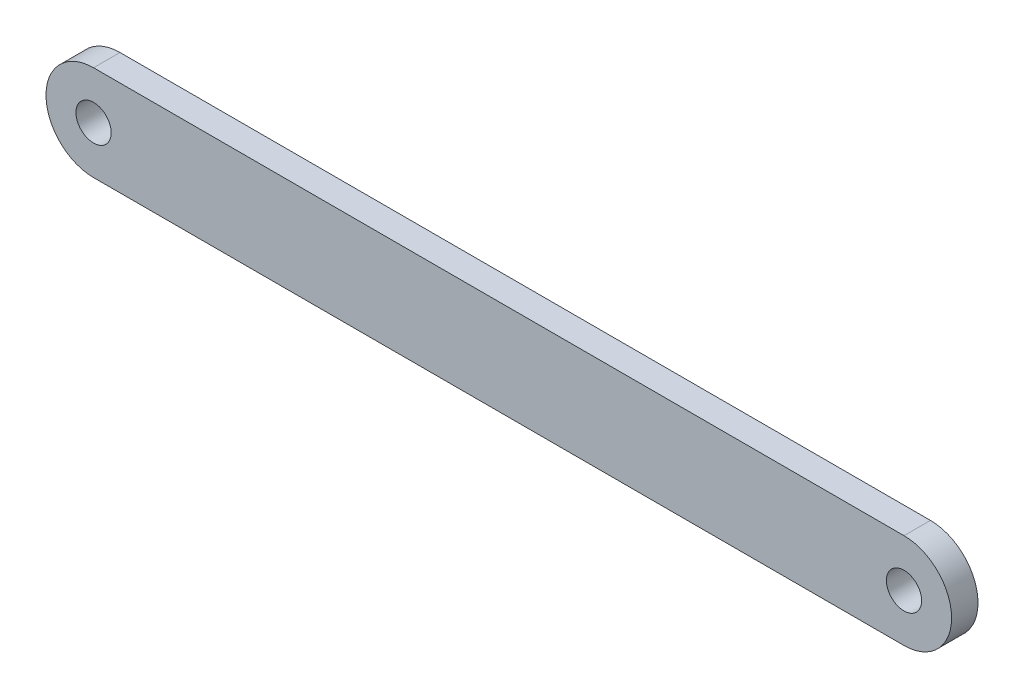
ISO-10303-21;
HEADER;
FILE_DESCRIPTION(('STEP AP214'),'2;1');
FILE_NAME('part.step','',(''),(''),'','','');
FILE_SCHEMA(('AUTOMOTIVE_DESIGN { 1 0 10303 214 1 1 1 1 }'));
ENDSEC;
DATA;
#1=APPLICATION_CONTEXT('core data for automotive mechanical design processes');
#2=APPLICATION_PROTOCOL_DEFINITION('international standard','automotive_design',2000,#1);
#3=PRODUCT_CONTEXT('',#1,'mechanical');
#4=PRODUCT('Part','Part','',(#3));
#5=PRODUCT_RELATED_PRODUCT_CATEGORY('part','',(#4));
#6=PRODUCT_DEFINITION_FORMATION('','',#4);
#7=PRODUCT_DEFINITION_CONTEXT('part definition',#1,'design');
#8=PRODUCT_DEFINITION('design','',#6,#7);
#9=PRODUCT_DEFINITION_SHAPE('','',#8);
#10=(LENGTH_UNIT() NAMED_UNIT(*) SI_UNIT(.MILLI.,.METRE.));
#11=(NAMED_UNIT(*) PLANE_ANGLE_UNIT() SI_UNIT($,.RADIAN.));
#12=(NAMED_UNIT(*) SI_UNIT($,.STERADIAN.) SOLID_ANGLE_UNIT());
#13=UNCERTAINTY_MEASURE_WITH_UNIT(LENGTH_MEASURE(1.E-05),#10,'distance_accuracy_value','');
#14=(GEOMETRIC_REPRESENTATION_CONTEXT(3) GLOBAL_UNCERTAINTY_ASSIGNED_CONTEXT((#13)) GLOBAL_UNIT_ASSIGNED_CONTEXT((#10,
#11,#12)) REPRESENTATION_CONTEXT('',''));
#15=CARTESIAN_POINT('',(0.,0.,0.));
#16=DIRECTION('',(0.,0.,1.));
#17=DIRECTION('',(1.,0.,0.));
#18=AXIS2_PLACEMENT_3D('',#15,#16,#17);
#19=CARTESIAN_POINT('',(230.,4.49640324973188E-12,-15.));
#20=DIRECTION('',(0.,0.,1.));
#21=DIRECTION('',(1.,0.,0.));
#22=AXIS2_PLACEMENT_3D('',#19,#20,#21);
#23=CYLINDRICAL_SURFACE('',#22,27.);
#24=CARTESIAN_POINT('',(230.,4.49640324973188E-12,0.));
#25=DIRECTION('',(0.,0.,1.));
#26=DIRECTION('',(-1.,0.,0.));
#27=AXIS2_PLACEMENT_3D('',#24,#25,#26);
#28=CIRCLE('',#27,27.);
#29=CARTESIAN_POINT('',(230.,-27.,0.));
#30=VERTEX_POINT('',#29);
#31=CARTESIAN_POINT('',(230.,27.,0.));
#32=VERTEX_POINT('',#31);
#33=EDGE_CURVE('E105',#30,#32,#28,.T.);
#34=ORIENTED_EDGE('',*,*,#33,.F.);
#35=DIRECTION('',(0.,0.,1.));
#36=VECTOR('',#35,1.);
#37=CARTESIAN_POINT('',(230.,-27.,-15.));
#38=LINE('',#37,#36);
#39=CARTESIAN_POINT('',(230.,-27.,-15.));
#40=VERTEX_POINT('',#39);
#41=EDGE_CURVE('E11',#40,#30,#38,.T.);
#42=ORIENTED_EDGE('',*,*,#41,.F.);
#43=CARTESIAN_POINT('',(230.,4.49640324973188E-12,-15.));
#44=DIRECTION('',(0.,0.,1.));
#45=DIRECTION('',(-1.,0.,0.));
#46=AXIS2_PLACEMENT_3D('',#43,#44,#45);
#47=CIRCLE('',#46,27.);
#48=CARTESIAN_POINT('',(230.,27.,-15.));
#49=VERTEX_POINT('',#48);
#50=EDGE_CURVE('E92',#40,#49,#47,.T.);
#51=ORIENTED_EDGE('',*,*,#50,.T.);
#52=DIRECTION('',(0.,0.,1.));
#53=VECTOR('',#52,1.);
#54=CARTESIAN_POINT('',(230.,27.,-15.));
#55=LINE('',#54,#53);
#56=EDGE_CURVE('E37',#49,#32,#55,.T.);
#57=ORIENTED_EDGE('',*,*,#56,.T.);
#58=EDGE_LOOP('',(#34,#42,#51,#57));
#59=FACE_BOUND('',#58,.T.);
#60=ADVANCED_FACE('F40',(#59),#23,.T.);
#61=CARTESIAN_POINT('',(-230.,-27.,-15.));
#62=DIRECTION('',(0.,-1.,0.));
#63=DIRECTION('',(0.,0.,-1.));
#64=AXIS2_PLACEMENT_3D('',#61,#62,#63);
#65=PLANE('',#64);
#66=DIRECTION('',(1.,0.,0.));
#67=VECTOR('',#66,1.);
#68=CARTESIAN_POINT('',(-230.,-27.,0.));
#69=LINE('',#68,#67);
#70=CARTESIAN_POINT('',(-230.,-26.9999999999955,0.));
#71=VERTEX_POINT('',#70);
#72=EDGE_CURVE('E100',#71,#30,#69,.T.);
#73=ORIENTED_EDGE('',*,*,#72,.F.);
#74=DIRECTION('',(0.,0.,1.));
#75=VECTOR('',#74,1.);
#76=CARTESIAN_POINT('',(-230.,-26.9999999999955,-15.));
#77=LINE('',#76,#75);
#78=CARTESIAN_POINT('',(-230.,-26.9999999999955,-15.));
#79=VERTEX_POINT('',#78);
#80=EDGE_CURVE('E46',#79,#71,#77,.T.);
#81=ORIENTED_EDGE('',*,*,#80,.F.);
#82=DIRECTION('',(1.,0.,0.));
#83=VECTOR('',#82,1.);
#84=CARTESIAN_POINT('',(-230.,-27.,-15.));
#85=LINE('',#84,#83);
#86=EDGE_CURVE('E95',#79,#40,#85,.T.);
#87=ORIENTED_EDGE('',*,*,#86,.T.);
#88=ORIENTED_EDGE('',*,*,#41,.T.);
#89=EDGE_LOOP('',(#73,#81,#87,#88));
#90=FACE_BOUND('',#89,.T.);
#91=ADVANCED_FACE('F114',(#90),#65,.T.);
#92=CARTESIAN_POINT('',(-230.,4.49640324973188E-12,-15.));
#93=DIRECTION('',(0.,0.,1.));
#94=DIRECTION('',(1.,0.,0.));
#95=AXIS2_PLACEMENT_3D('',#92,#93,#94);
#96=CYLINDRICAL_SURFACE('',#95,27.);
#97=CARTESIAN_POINT('',(-230.,4.49640324973188E-12,0.));
#98=DIRECTION('',(0.,0.,1.));
#99=DIRECTION('',(1.,0.,0.));
#100=AXIS2_PLACEMENT_3D('',#97,#98,#99);
#101=CIRCLE('',#100,27.);
#102=CARTESIAN_POINT('',(-230.,27.,0.));
#103=VERTEX_POINT('',#102);
#104=EDGE_CURVE('E87',#103,#71,#101,.T.);
#105=ORIENTED_EDGE('',*,*,#104,.F.);
#106=DIRECTION('',(0.,0.,1.));
#107=VECTOR('',#106,1.);
#108=CARTESIAN_POINT('',(-230.,27.,-15.));
#109=LINE('',#108,#107);
#110=CARTESIAN_POINT('',(-230.,27.,-15.));
#111=VERTEX_POINT('',#110);
#112=EDGE_CURVE('E85',#111,#103,#109,.T.);
#113=ORIENTED_EDGE('',*,*,#112,.F.);
#114=CARTESIAN_POINT('',(-230.,4.49640324973188E-12,-15.));
#115=DIRECTION('',(0.,0.,1.));
#116=DIRECTION('',(1.,0.,0.));
#117=AXIS2_PLACEMENT_3D('',#114,#115,#116);
#118=CIRCLE('',#117,27.);
#119=EDGE_CURVE('E83',#111,#79,#118,.T.);
#120=ORIENTED_EDGE('',*,*,#119,.T.);
#121=ORIENTED_EDGE('',*,*,#80,.T.);
#122=EDGE_LOOP('',(#105,#113,#120,#121));
#123=FACE_BOUND('',#122,.T.);
#124=ADVANCED_FACE('F81',(#123),#96,.T.);
#125=CARTESIAN_POINT('',(-230.,27.,-15.));
#126=DIRECTION('',(0.,1.,0.));
#127=DIRECTION('',(0.,0.,1.));
#128=AXIS2_PLACEMENT_3D('',#125,#126,#127);
#129=PLANE('',#128);
#130=DIRECTION('',(-1.,0.,0.));
#131=VECTOR('',#130,1.);
#132=CARTESIAN_POINT('',(-230.,27.,0.));
#133=LINE('',#132,#131);
#134=EDGE_CURVE('E104',#32,#103,#133,.T.);
#135=ORIENTED_EDGE('',*,*,#134,.F.);
#136=ORIENTED_EDGE('',*,*,#56,.F.);
#137=DIRECTION('',(-1.,0.,0.));
#138=VECTOR('',#137,1.);
#139=CARTESIAN_POINT('',(-230.,27.,-15.));
#140=LINE('',#139,#138);
#141=EDGE_CURVE('E93',#49,#111,#140,.T.);
#142=ORIENTED_EDGE('',*,*,#141,.T.);
#143=ORIENTED_EDGE('',*,*,#112,.T.);
#144=EDGE_LOOP('',(#135,#136,#142,#143));
#145=FACE_BOUND('',#144,.T.);
#146=ADVANCED_FACE('F94',(#145),#129,.T.);
#147=CARTESIAN_POINT('',(230.,4.49640324973188E-12,-15.));
#148=DIRECTION('',(0.,0.,-1.));
#149=DIRECTION('',(-1.,0.,0.));
#150=AXIS2_PLACEMENT_3D('',#147,#148,#149);
#151=PLANE('',#150);
#152=CARTESIAN_POINT('',(230.,4.49640324973188E-12,-15.));
#153=DIRECTION('',(0.,0.,1.));
#154=DIRECTION('',(-1.,0.,0.));
#155=AXIS2_PLACEMENT_3D('',#152,#153,#154);
#156=CIRCLE('',#155,9.99999999999869);
#157=CARTESIAN_POINT('',(220.000000000001,4.49640324973188E-12,-15.));
#158=VERTEX_POINT('',#157);
#159=EDGE_CURVE('E148',#158,#158,#156,.T.);
#160=ORIENTED_EDGE('',*,*,#159,.T.);
#161=EDGE_LOOP('',(#160));
#162=FACE_BOUND('',#161,.T.);
#163=CARTESIAN_POINT('',(-230.,0.,-15.));
#164=DIRECTION('',(0.,0.,1.));
#165=DIRECTION('',(1.,0.,0.));
#166=AXIS2_PLACEMENT_3D('',#163,#164,#165);
#167=CIRCLE('',#166,10.);
#168=CARTESIAN_POINT('',(-220.,0.,-15.));
#169=VERTEX_POINT('',#168);
#170=EDGE_CURVE('E106',#169,#169,#167,.T.);
#171=ORIENTED_EDGE('',*,*,#170,.T.);
#172=EDGE_LOOP('',(#171));
#173=FACE_BOUND('',#172,.T.);
#174=ORIENTED_EDGE('',*,*,#50,.F.);
#175=ORIENTED_EDGE('',*,*,#86,.F.);
#176=ORIENTED_EDGE('',*,*,#119,.F.);
#177=ORIENTED_EDGE('',*,*,#141,.F.);
#178=EDGE_LOOP('',(#174,#175,#176,#177));
#179=FACE_BOUND('',#178,.T.);
#180=ADVANCED_FACE('F89',(#162,#173,#179),#151,.T.);
#181=CARTESIAN_POINT('',(230.,4.49640324973188E-12,0.));
#182=DIRECTION('',(0.,0.,-1.));
#183=DIRECTION('',(-1.,0.,0.));
#184=AXIS2_PLACEMENT_3D('',#181,#182,#183);
#185=PLANE('',#184);
#186=CARTESIAN_POINT('',(230.,4.49640324973188E-12,0.));
#187=DIRECTION('',(0.,0.,1.));
#188=DIRECTION('',(-1.,0.,0.));
#189=AXIS2_PLACEMENT_3D('',#186,#187,#188);
#190=CIRCLE('',#189,9.99999999999869);
#191=CARTESIAN_POINT('',(220.000000000001,4.49640324973188E-12,0.));
#192=VERTEX_POINT('',#191);
#193=EDGE_CURVE('E149',#192,#192,#190,.T.);
#194=ORIENTED_EDGE('',*,*,#193,.F.);
#195=EDGE_LOOP('',(#194));
#196=FACE_BOUND('',#195,.T.);
#197=CARTESIAN_POINT('',(-230.,0.,0.));
#198=DIRECTION('',(0.,0.,1.));
#199=DIRECTION('',(1.,0.,0.));
#200=AXIS2_PLACEMENT_3D('',#197,#198,#199);
#201=CIRCLE('',#200,10.);
#202=CARTESIAN_POINT('',(-220.,0.,0.));
#203=VERTEX_POINT('',#202);
#204=EDGE_CURVE('E151',#203,#203,#201,.T.);
#205=ORIENTED_EDGE('',*,*,#204,.F.);
#206=EDGE_LOOP('',(#205));
#207=FACE_BOUND('',#206,.T.);
#208=ORIENTED_EDGE('',*,*,#33,.T.);
#209=ORIENTED_EDGE('',*,*,#134,.T.);
#210=ORIENTED_EDGE('',*,*,#104,.T.);
#211=ORIENTED_EDGE('',*,*,#72,.T.);
#212=EDGE_LOOP('',(#208,#209,#210,#211));
#213=FACE_BOUND('',#212,.T.);
#214=ADVANCED_FACE('F115',(#196,#207,#213),#185,.F.);
#215=CARTESIAN_POINT('',(-230.,0.,-15.));
#216=DIRECTION('',(0.,0.,1.));
#217=DIRECTION('',(1.,0.,0.));
#218=AXIS2_PLACEMENT_3D('',#215,#216,#217);
#219=CYLINDRICAL_SURFACE('',#218,10.);
#220=ORIENTED_EDGE('',*,*,#170,.F.);
#221=EDGE_LOOP('',(#220));
#222=FACE_BOUND('',#221,.T.);
#223=ORIENTED_EDGE('',*,*,#204,.T.);
#224=EDGE_LOOP('',(#223));
#225=FACE_BOUND('',#224,.T.);
#226=ADVANCED_FACE('F131',(#222,#225),#219,.F.);
#227=CARTESIAN_POINT('',(230.,4.49640324973188E-12,-15.));
#228=DIRECTION('',(0.,0.,1.));
#229=DIRECTION('',(1.,0.,0.));
#230=AXIS2_PLACEMENT_3D('',#227,#228,#229);
#231=CYLINDRICAL_SURFACE('',#230,9.99999999999869);
#232=ORIENTED_EDGE('',*,*,#159,.F.);
#233=EDGE_LOOP('',(#232));
#234=FACE_BOUND('',#233,.T.);
#235=ORIENTED_EDGE('',*,*,#193,.T.);
#236=EDGE_LOOP('',(#235));
#237=FACE_BOUND('',#236,.T.);
#238=ADVANCED_FACE('F139',(#234,#237),#231,.F.);
#239=CLOSED_SHELL('',(#60,#91,#124,#146,#180,#214,#226,#238));
#240=MANIFOLD_SOLID_BREP('B2',#239);
#241=ADVANCED_BREP_SHAPE_REPRESENTATION('',(#18,#240),#14);
#242=SHAPE_DEFINITION_REPRESENTATION(#9,#241);
ENDSEC;
END-ISO-10303-21;
